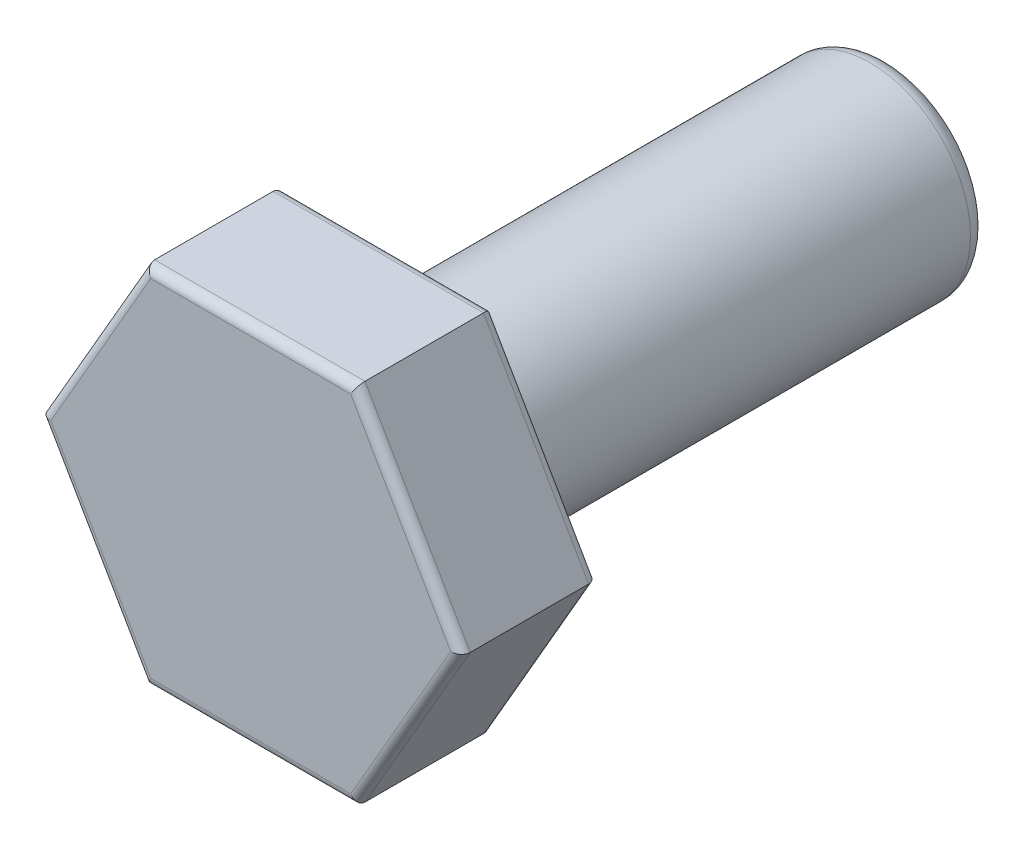
ISO-10303-21;
HEADER;
FILE_DESCRIPTION(('STEP AP214'),'2;1');
FILE_NAME('part.step','',(''),(''),'','','');
FILE_SCHEMA(('AUTOMOTIVE_DESIGN { 1 0 10303 214 1 1 1 1 }'));
ENDSEC;
DATA;
#1=APPLICATION_CONTEXT('core data for automotive mechanical design processes');
#2=APPLICATION_PROTOCOL_DEFINITION('international standard','automotive_design',2000,#1);
#3=PRODUCT_CONTEXT('',#1,'mechanical');
#4=PRODUCT('Part','Part','',(#3));
#5=PRODUCT_RELATED_PRODUCT_CATEGORY('part','',(#4));
#6=PRODUCT_DEFINITION_FORMATION('','',#4);
#7=PRODUCT_DEFINITION_CONTEXT('part definition',#1,'design');
#8=PRODUCT_DEFINITION('design','',#6,#7);
#9=PRODUCT_DEFINITION_SHAPE('','',#8);
#10=(LENGTH_UNIT() NAMED_UNIT(*) SI_UNIT(.MILLI.,.METRE.));
#11=(NAMED_UNIT(*) PLANE_ANGLE_UNIT() SI_UNIT($,.RADIAN.));
#12=(NAMED_UNIT(*) SI_UNIT($,.STERADIAN.) SOLID_ANGLE_UNIT());
#13=UNCERTAINTY_MEASURE_WITH_UNIT(LENGTH_MEASURE(1.E-05),#10,'distance_accuracy_value','');
#14=(GEOMETRIC_REPRESENTATION_CONTEXT(3) GLOBAL_UNCERTAINTY_ASSIGNED_CONTEXT((#13)) GLOBAL_UNIT_ASSIGNED_CONTEXT((#10,
#11,#12)) REPRESENTATION_CONTEXT('',''));
#15=CARTESIAN_POINT('',(0.,0.,0.));
#16=DIRECTION('',(0.,0.,1.));
#17=DIRECTION('',(1.,0.,0.));
#18=AXIS2_PLACEMENT_3D('',#15,#16,#17);
#19=CARTESIAN_POINT('',(0.,0.,55.));
#20=DIRECTION('',(0.,0.,-1.));
#21=DIRECTION('',(-1.,0.,0.));
#22=AXIS2_PLACEMENT_3D('',#19,#20,#21);
#23=CYLINDRICAL_SURFACE('',#22,11.);
#24=CARTESIAN_POINT('',(0.,0.,2.));
#25=DIRECTION('',(0.,0.,1.));
#26=DIRECTION('',(1.,0.,0.));
#27=AXIS2_PLACEMENT_3D('',#24,#25,#26);
#28=CIRCLE('',#27,11.);
#29=CARTESIAN_POINT('',(11.,0.,2.));
#30=VERTEX_POINT('',#29);
#31=EDGE_CURVE('E42',#30,#30,#28,.T.);
#32=ORIENTED_EDGE('',*,*,#31,.T.);
#33=EDGE_LOOP('',(#32));
#34=FACE_BOUND('',#33,.T.);
#35=CARTESIAN_POINT('',(0.,0.,55.));
#36=DIRECTION('',(0.,0.,1.));
#37=DIRECTION('',(1.,0.,0.));
#38=AXIS2_PLACEMENT_3D('',#35,#36,#37);
#39=CIRCLE('',#38,11.);
#40=CARTESIAN_POINT('',(11.,0.,55.));
#41=VERTEX_POINT('',#40);
#42=EDGE_CURVE('E148',#41,#41,#39,.T.);
#43=ORIENTED_EDGE('',*,*,#42,.F.);
#44=EDGE_LOOP('',(#43));
#45=FACE_BOUND('',#44,.T.);
#46=ADVANCED_FACE('F34',(#34,#45),#23,.T.);
#47=CARTESIAN_POINT('',(0.,0.,0.));
#48=DIRECTION('',(0.,0.,1.));
#49=DIRECTION('',(1.,0.,0.));
#50=AXIS2_PLACEMENT_3D('',#47,#48,#49);
#51=PLANE('',#50);
#52=CARTESIAN_POINT('',(0.,0.,0.));
#53=DIRECTION('',(0.,0.,1.));
#54=DIRECTION('',(1.,0.,0.));
#55=AXIS2_PLACEMENT_3D('',#52,#53,#54);
#56=CIRCLE('',#55,9.);
#57=CARTESIAN_POINT('',(9.,0.,0.));
#58=VERTEX_POINT('',#57);
#59=EDGE_CURVE('E11',#58,#58,#56,.F.);
#60=ORIENTED_EDGE('',*,*,#59,.T.);
#61=EDGE_LOOP('',(#60));
#62=FACE_BOUND('',#61,.T.);
#63=ADVANCED_FACE('F293',(#62),#51,.F.);
#64=CARTESIAN_POINT('',(0.,0.,55.));
#65=DIRECTION('',(0.,0.,1.));
#66=DIRECTION('',(1.,0.,0.));
#67=AXIS2_PLACEMENT_3D('',#64,#65,#66);
#68=PLANE('',#67);
#69=DIRECTION('',(-0.5,0.866025403784438,0.));
#70=VECTOR('',#69,1.);
#71=CARTESIAN_POINT('',(16.4544826719043,9.50000000000001,55.));
#72=LINE('',#71,#70);
#73=CARTESIAN_POINT('',(10.9696551146029,19.,55.));
#74=VERTEX_POINT('',#73);
#75=CARTESIAN_POINT('',(21.9393102292058,0.,55.));
#76=VERTEX_POINT('',#75);
#77=EDGE_CURVE('E208',#74,#76,#72,.F.);
#78=ORIENTED_EDGE('',*,*,#77,.T.);
#79=DIRECTION('',(0.5,0.866025403784439,0.));
#80=VECTOR('',#79,1.);
#81=CARTESIAN_POINT('',(16.4544826719043,-9.49999999999999,55.));
#82=LINE('',#81,#80);
#83=CARTESIAN_POINT('',(10.9696551146029,-19.,55.));
#84=VERTEX_POINT('',#83);
#85=EDGE_CURVE('E218',#76,#84,#82,.F.);
#86=ORIENTED_EDGE('',*,*,#85,.T.);
#87=DIRECTION('',(1.,0.,0.));
#88=VECTOR('',#87,1.);
#89=CARTESIAN_POINT('',(0.,-19.,55.));
#90=LINE('',#89,#88);
#91=CARTESIAN_POINT('',(-10.9696551146029,-19.,55.));
#92=VERTEX_POINT('',#91);
#93=EDGE_CURVE('E216',#84,#92,#90,.F.);
#94=ORIENTED_EDGE('',*,*,#93,.T.);
#95=DIRECTION('',(0.5,-0.866025403784439,0.));
#96=VECTOR('',#95,1.);
#97=CARTESIAN_POINT('',(-16.4544826719043,-9.5,55.));
#98=LINE('',#97,#96);
#99=CARTESIAN_POINT('',(-21.9393102292058,0.,55.));
#100=VERTEX_POINT('',#99);
#101=EDGE_CURVE('E214',#92,#100,#98,.F.);
#102=ORIENTED_EDGE('',*,*,#101,.T.);
#103=DIRECTION('',(-0.5,-0.866025403784439,0.));
#104=VECTOR('',#103,1.);
#105=CARTESIAN_POINT('',(-16.4544826719043,9.5,55.));
#106=LINE('',#105,#104);
#107=CARTESIAN_POINT('',(-10.9696551146029,19.,55.));
#108=VERTEX_POINT('',#107);
#109=EDGE_CURVE('E212',#100,#108,#106,.F.);
#110=ORIENTED_EDGE('',*,*,#109,.T.);
#111=DIRECTION('',(-1.,0.,0.));
#112=VECTOR('',#111,1.);
#113=CARTESIAN_POINT('',(0.,19.,55.));
#114=LINE('',#113,#112);
#115=EDGE_CURVE('E210',#108,#74,#114,.F.);
#116=ORIENTED_EDGE('',*,*,#115,.T.);
#117=EDGE_LOOP('',(#78,#86,#94,#102,#110,#116));
#118=FACE_BOUND('',#117,.T.);
#119=ORIENTED_EDGE('',*,*,#42,.T.);
#120=EDGE_LOOP('',(#119));
#121=FACE_BOUND('',#120,.T.);
#122=ADVANCED_FACE('F298',(#118,#121),#68,.F.);
#123=CARTESIAN_POINT('',(-11.5470053837925,-20.,70.));
#124=DIRECTION('',(0.,1.,0.));
#125=DIRECTION('',(0.,0.,1.));
#126=AXIS2_PLACEMENT_3D('',#123,#124,#125);
#127=PLANE('',#126);
#128=DIRECTION('',(0.,0.,-1.));
#129=VECTOR('',#128,1.);
#130=CARTESIAN_POINT('',(11.5470053837925,-20.,70.));
#131=LINE('',#130,#129);
#132=CARTESIAN_POINT('',(11.5470053837925,-20.,69.));
#133=VERTEX_POINT('',#132);
#134=CARTESIAN_POINT('',(11.5470053837925,-20.,56.));
#135=VERTEX_POINT('',#134);
#136=EDGE_CURVE('E264',#133,#135,#131,.T.);
#137=ORIENTED_EDGE('',*,*,#136,.F.);
#138=DIRECTION('',(1.,0.,0.));
#139=VECTOR('',#138,1.);
#140=CARTESIAN_POINT('',(-11.5470053837925,-20.,69.));
#141=LINE('',#140,#139);
#142=CARTESIAN_POINT('',(-11.5470053837925,-20.,69.));
#143=VERTEX_POINT('',#142);
#144=EDGE_CURVE('E203',#133,#143,#141,.F.);
#145=ORIENTED_EDGE('',*,*,#144,.T.);
#146=DIRECTION('',(0.,0.,-1.));
#147=VECTOR('',#146,1.);
#148=CARTESIAN_POINT('',(-11.5470053837925,-20.,70.));
#149=LINE('',#148,#147);
#150=CARTESIAN_POINT('',(-11.5470053837925,-20.,56.));
#151=VERTEX_POINT('',#150);
#152=EDGE_CURVE('E154',#143,#151,#149,.T.);
#153=ORIENTED_EDGE('',*,*,#152,.T.);
#154=DIRECTION('',(1.,0.,0.));
#155=VECTOR('',#154,1.);
#156=CARTESIAN_POINT('',(-11.5470053837925,-20.,56.));
#157=LINE('',#156,#155);
#158=EDGE_CURVE('E250',#151,#135,#157,.T.);
#159=ORIENTED_EDGE('',*,*,#158,.T.);
#160=EDGE_LOOP('',(#137,#145,#153,#159));
#161=FACE_BOUND('',#160,.T.);
#162=ADVANCED_FACE('F272',(#161),#127,.F.);
#163=CARTESIAN_POINT('',(11.5470053837925,-20.,70.));
#164=DIRECTION('',(-0.866025403784439,0.5,0.));
#165=DIRECTION('',(-0.5,-0.866025403784439,0.));
#166=AXIS2_PLACEMENT_3D('',#163,#164,#165);
#167=PLANE('',#166);
#168=DIRECTION('',(0.,0.,-1.));
#169=VECTOR('',#168,1.);
#170=CARTESIAN_POINT('',(23.094010767585,0.,70.));
#171=LINE('',#170,#169);
#172=CARTESIAN_POINT('',(23.094010767585,0.,69.));
#173=VERTEX_POINT('',#172);
#174=CARTESIAN_POINT('',(23.094010767585,0.,56.));
#175=VERTEX_POINT('',#174);
#176=EDGE_CURVE('E266',#173,#175,#171,.T.);
#177=ORIENTED_EDGE('',*,*,#176,.F.);
#178=DIRECTION('',(0.5,0.866025403784439,0.));
#179=VECTOR('',#178,1.);
#180=CARTESIAN_POINT('',(11.5470053837925,-20.,69.));
#181=LINE('',#180,#179);
#182=EDGE_CURVE('E193',#173,#133,#181,.F.);
#183=ORIENTED_EDGE('',*,*,#182,.T.);
#184=ORIENTED_EDGE('',*,*,#136,.T.);
#185=DIRECTION('',(0.5,0.866025403784439,0.));
#186=VECTOR('',#185,1.);
#187=CARTESIAN_POINT('',(11.5470053837925,-20.,56.));
#188=LINE('',#187,#186);
#189=EDGE_CURVE('E199',#135,#175,#188,.T.);
#190=ORIENTED_EDGE('',*,*,#189,.T.);
#191=EDGE_LOOP('',(#177,#183,#184,#190));
#192=FACE_BOUND('',#191,.T.);
#193=ADVANCED_FACE('F393',(#192),#167,.F.);
#194=CARTESIAN_POINT('',(23.094010767585,0.,70.));
#195=DIRECTION('',(-0.866025403784438,-0.5,0.));
#196=DIRECTION('',(0.5,-0.866025403784438,0.));
#197=AXIS2_PLACEMENT_3D('',#194,#195,#196);
#198=PLANE('',#197);
#199=DIRECTION('',(0.,0.,-1.));
#200=VECTOR('',#199,1.);
#201=CARTESIAN_POINT('',(11.5470053837925,20.,70.));
#202=LINE('',#201,#200);
#203=CARTESIAN_POINT('',(11.5470053837925,20.,69.));
#204=VERTEX_POINT('',#203);
#205=CARTESIAN_POINT('',(11.5470053837925,20.,56.));
#206=VERTEX_POINT('',#205);
#207=EDGE_CURVE('E269',#204,#206,#202,.T.);
#208=ORIENTED_EDGE('',*,*,#207,.F.);
#209=DIRECTION('',(-0.5,0.866025403784438,0.));
#210=VECTOR('',#209,1.);
#211=CARTESIAN_POINT('',(23.094010767585,0.,69.));
#212=LINE('',#211,#210);
#213=EDGE_CURVE('E151',#204,#173,#212,.F.);
#214=ORIENTED_EDGE('',*,*,#213,.T.);
#215=ORIENTED_EDGE('',*,*,#176,.T.);
#216=DIRECTION('',(-0.5,0.866025403784438,0.));
#217=VECTOR('',#216,1.);
#218=CARTESIAN_POINT('',(23.094010767585,0.,56.));
#219=LINE('',#218,#217);
#220=EDGE_CURVE('E198',#175,#206,#219,.T.);
#221=ORIENTED_EDGE('',*,*,#220,.T.);
#222=EDGE_LOOP('',(#208,#214,#215,#221));
#223=FACE_BOUND('',#222,.T.);
#224=ADVANCED_FACE('F399',(#223),#198,.F.);
#225=CARTESIAN_POINT('',(11.5470053837925,20.,70.));
#226=DIRECTION('',(0.,-1.,0.));
#227=DIRECTION('',(0.,0.,-1.));
#228=AXIS2_PLACEMENT_3D('',#225,#226,#227);
#229=PLANE('',#228);
#230=DIRECTION('',(0.,0.,-1.));
#231=VECTOR('',#230,1.);
#232=CARTESIAN_POINT('',(-11.5470053837925,20.,70.));
#233=LINE('',#232,#231);
#234=CARTESIAN_POINT('',(-11.5470053837925,20.,69.));
#235=VERTEX_POINT('',#234);
#236=CARTESIAN_POINT('',(-11.5470053837925,20.,56.));
#237=VERTEX_POINT('',#236);
#238=EDGE_CURVE('E229',#235,#237,#233,.T.);
#239=ORIENTED_EDGE('',*,*,#238,.F.);
#240=DIRECTION('',(-1.,0.,0.));
#241=VECTOR('',#240,1.);
#242=CARTESIAN_POINT('',(11.5470053837925,20.,69.));
#243=LINE('',#242,#241);
#244=EDGE_CURVE('E178',#235,#204,#243,.F.);
#245=ORIENTED_EDGE('',*,*,#244,.T.);
#246=ORIENTED_EDGE('',*,*,#207,.T.);
#247=DIRECTION('',(-1.,0.,0.));
#248=VECTOR('',#247,1.);
#249=CARTESIAN_POINT('',(11.5470053837925,20.,56.));
#250=LINE('',#249,#248);
#251=EDGE_CURVE('E49',#206,#237,#250,.T.);
#252=ORIENTED_EDGE('',*,*,#251,.T.);
#253=EDGE_LOOP('',(#239,#245,#246,#252));
#254=FACE_BOUND('',#253,.T.);
#255=ADVANCED_FACE('F406',(#254),#229,.F.);
#256=CARTESIAN_POINT('',(-11.5470053837925,20.,70.));
#257=DIRECTION('',(0.866025403784439,-0.5,0.));
#258=DIRECTION('',(0.5,0.866025403784439,0.));
#259=AXIS2_PLACEMENT_3D('',#256,#257,#258);
#260=PLANE('',#259);
#261=ORIENTED_EDGE('',*,*,#238,.T.);
#262=DIRECTION('',(-0.5,-0.866025403784439,0.));
#263=VECTOR('',#262,1.);
#264=CARTESIAN_POINT('',(-11.5470053837925,20.,56.));
#265=LINE('',#264,#263);
#266=CARTESIAN_POINT('',(-23.094010767585,0.,56.));
#267=VERTEX_POINT('',#266);
#268=EDGE_CURVE('E183',#237,#267,#265,.T.);
#269=ORIENTED_EDGE('',*,*,#268,.T.);
#270=DIRECTION('',(0.,0.,-1.));
#271=VECTOR('',#270,1.);
#272=CARTESIAN_POINT('',(-23.094010767585,0.,70.));
#273=LINE('',#272,#271);
#274=CARTESIAN_POINT('',(-23.094010767585,0.,69.));
#275=VERTEX_POINT('',#274);
#276=EDGE_CURVE('E228',#275,#267,#273,.T.);
#277=ORIENTED_EDGE('',*,*,#276,.F.);
#278=DIRECTION('',(-0.5,-0.866025403784439,0.));
#279=VECTOR('',#278,1.);
#280=CARTESIAN_POINT('',(-11.5470053837925,20.,69.));
#281=LINE('',#280,#279);
#282=EDGE_CURVE('E56',#275,#235,#281,.F.);
#283=ORIENTED_EDGE('',*,*,#282,.T.);
#284=EDGE_LOOP('',(#261,#269,#277,#283));
#285=FACE_BOUND('',#284,.T.);
#286=ADVANCED_FACE('F227',(#285),#260,.F.);
#287=CARTESIAN_POINT('',(-23.094010767585,0.,70.));
#288=DIRECTION('',(0.866025403784439,0.5,0.));
#289=DIRECTION('',(-0.5,0.866025403784439,0.));
#290=AXIS2_PLACEMENT_3D('',#287,#288,#289);
#291=PLANE('',#290);
#292=ORIENTED_EDGE('',*,*,#152,.F.);
#293=DIRECTION('',(0.5,-0.866025403784439,0.));
#294=VECTOR('',#293,1.);
#295=CARTESIAN_POINT('',(-23.094010767585,0.,69.));
#296=LINE('',#295,#294);
#297=EDGE_CURVE('E223',#143,#275,#296,.F.);
#298=ORIENTED_EDGE('',*,*,#297,.T.);
#299=ORIENTED_EDGE('',*,*,#276,.T.);
#300=DIRECTION('',(0.5,-0.866025403784439,0.));
#301=VECTOR('',#300,1.);
#302=CARTESIAN_POINT('',(-23.094010767585,0.,56.));
#303=LINE('',#302,#301);
#304=EDGE_CURVE('E221',#267,#151,#303,.T.);
#305=ORIENTED_EDGE('',*,*,#304,.T.);
#306=EDGE_LOOP('',(#292,#298,#299,#305));
#307=FACE_BOUND('',#306,.T.);
#308=ADVANCED_FACE('F235',(#307),#291,.F.);
#309=CARTESIAN_POINT('',(0.,0.,70.));
#310=DIRECTION('',(0.,0.,1.));
#311=DIRECTION('',(1.,0.,0.));
#312=AXIS2_PLACEMENT_3D('',#309,#310,#311);
#313=PLANE('',#312);
#314=DIRECTION('',(0.5,-0.866025403784439,0.));
#315=VECTOR('',#314,1.);
#316=CARTESIAN_POINT('',(-10.6809799800081,-19.5,70.));
#317=LINE('',#316,#315);
#318=CARTESIAN_POINT('',(-21.9393102292058,0.,70.));
#319=VERTEX_POINT('',#318);
#320=CARTESIAN_POINT('',(-10.9696551146029,-19.,70.));
#321=VERTEX_POINT('',#320);
#322=EDGE_CURVE('E136',#319,#321,#317,.T.);
#323=ORIENTED_EDGE('',*,*,#322,.T.);
#324=DIRECTION('',(1.,0.,0.));
#325=VECTOR('',#324,1.);
#326=CARTESIAN_POINT('',(11.5470053837925,-19.,70.));
#327=LINE('',#326,#325);
#328=CARTESIAN_POINT('',(10.9696551146029,-19.,70.));
#329=VERTEX_POINT('',#328);
#330=EDGE_CURVE('E254',#321,#329,#327,.T.);
#331=ORIENTED_EDGE('',*,*,#330,.T.);
#332=DIRECTION('',(0.5,0.866025403784439,0.));
#333=VECTOR('',#332,1.);
#334=CARTESIAN_POINT('',(22.2279853638006,0.500000000000018,70.));
#335=LINE('',#334,#333);
#336=CARTESIAN_POINT('',(21.9393102292058,0.,70.));
#337=VERTEX_POINT('',#336);
#338=EDGE_CURVE('E131',#329,#337,#335,.T.);
#339=ORIENTED_EDGE('',*,*,#338,.T.);
#340=DIRECTION('',(-0.5,0.866025403784438,0.));
#341=VECTOR('',#340,1.);
#342=CARTESIAN_POINT('',(10.6809799800081,19.5,70.));
#343=LINE('',#342,#341);
#344=CARTESIAN_POINT('',(10.9696551146029,19.,70.));
#345=VERTEX_POINT('',#344);
#346=EDGE_CURVE('E124',#337,#345,#343,.T.);
#347=ORIENTED_EDGE('',*,*,#346,.T.);
#348=DIRECTION('',(-1.,0.,0.));
#349=VECTOR('',#348,1.);
#350=CARTESIAN_POINT('',(-11.5470053837925,19.,70.));
#351=LINE('',#350,#349);
#352=CARTESIAN_POINT('',(-10.9696551146029,19.,70.));
#353=VERTEX_POINT('',#352);
#354=EDGE_CURVE('E127',#345,#353,#351,.T.);
#355=ORIENTED_EDGE('',*,*,#354,.T.);
#356=DIRECTION('',(-0.5,-0.866025403784439,0.));
#357=VECTOR('',#356,1.);
#358=CARTESIAN_POINT('',(-22.2279853638006,-0.500000000000004,70.));
#359=LINE('',#358,#357);
#360=EDGE_CURVE('E147',#353,#319,#359,.T.);
#361=ORIENTED_EDGE('',*,*,#360,.T.);
#362=EDGE_LOOP('',(#323,#331,#339,#347,#355,#361));
#363=FACE_BOUND('',#362,.T.);
#364=ADVANCED_FACE('F126',(#363),#313,.T.);
#365=CARTESIAN_POINT('',(0.,19.,69.));
#366=DIRECTION('',(1.,0.,0.));
#367=DIRECTION('',(0.,0.,-1.));
#368=AXIS2_PLACEMENT_3D('',#365,#366,#367);
#369=CYLINDRICAL_SURFACE('',#368,1.);
#370=CARTESIAN_POINT('',(10.9696551146029,19.,69.));
#371=DIRECTION('',(0.866025403784439,-0.5,0.));
#372=DIRECTION('',(0.5,0.866025403784439,0.));
#373=AXIS2_PLACEMENT_3D('',#370,#371,#372);
#374=ELLIPSE('',#373,1.15470053837925,1.);
#375=EDGE_CURVE('E142',#204,#345,#374,.T.);
#376=ORIENTED_EDGE('',*,*,#375,.F.);
#377=ORIENTED_EDGE('',*,*,#244,.F.);
#378=CARTESIAN_POINT('',(-10.9696551146029,19.,69.));
#379=DIRECTION('',(0.866025403784439,0.5,0.));
#380=DIRECTION('',(0.5,-0.866025403784439,0.));
#381=AXIS2_PLACEMENT_3D('',#378,#379,#380);
#382=ELLIPSE('',#381,1.15470053837925,1.);
#383=EDGE_CURVE('E145',#353,#235,#382,.F.);
#384=ORIENTED_EDGE('',*,*,#383,.F.);
#385=ORIENTED_EDGE('',*,*,#354,.F.);
#386=EDGE_LOOP('',(#376,#377,#384,#385));
#387=FACE_BOUND('',#386,.T.);
#388=ADVANCED_FACE('F140',(#387),#369,.T.);
#389=CARTESIAN_POINT('',(-16.4544826719043,9.5,69.));
#390=DIRECTION('',(0.5,0.866025403784439,0.));
#391=DIRECTION('',(-0.866025403784439,0.5,0.));
#392=AXIS2_PLACEMENT_3D('',#389,#390,#391);
#393=CYLINDRICAL_SURFACE('',#392,1.);
#394=ORIENTED_EDGE('',*,*,#383,.T.);
#395=ORIENTED_EDGE('',*,*,#282,.F.);
#396=CARTESIAN_POINT('',(-21.9393102292058,0.,69.));
#397=DIRECTION('',(0.,1.,0.));
#398=DIRECTION('',(1.,0.,0.));
#399=AXIS2_PLACEMENT_3D('',#396,#397,#398);
#400=ELLIPSE('',#399,1.15470053837925,1.);
#401=EDGE_CURVE('E152',#319,#275,#400,.F.);
#402=ORIENTED_EDGE('',*,*,#401,.F.);
#403=ORIENTED_EDGE('',*,*,#360,.F.);
#404=EDGE_LOOP('',(#394,#395,#402,#403));
#405=FACE_BOUND('',#404,.T.);
#406=ADVANCED_FACE('F283',(#405),#393,.T.);
#407=CARTESIAN_POINT('',(16.4544826719043,9.50000000000001,69.));
#408=DIRECTION('',(0.5,-0.866025403784438,0.));
#409=DIRECTION('',(0.866025403784438,0.5,0.));
#410=AXIS2_PLACEMENT_3D('',#407,#408,#409);
#411=CYLINDRICAL_SURFACE('',#410,1.);
#412=ORIENTED_EDGE('',*,*,#375,.T.);
#413=ORIENTED_EDGE('',*,*,#346,.F.);
#414=CARTESIAN_POINT('',(21.9393102292058,0.,69.));
#415=DIRECTION('',(0.,-1.,0.));
#416=DIRECTION('',(1.,0.,0.));
#417=AXIS2_PLACEMENT_3D('',#414,#415,#416);
#418=ELLIPSE('',#417,1.15470053837925,1.);
#419=EDGE_CURVE('E157',#173,#337,#418,.T.);
#420=ORIENTED_EDGE('',*,*,#419,.F.);
#421=ORIENTED_EDGE('',*,*,#213,.F.);
#422=EDGE_LOOP('',(#412,#413,#420,#421));
#423=FACE_BOUND('',#422,.T.);
#424=ADVANCED_FACE('F150',(#423),#411,.T.);
#425=CARTESIAN_POINT('',(-16.4544826719043,-9.5,69.));
#426=DIRECTION('',(-0.5,0.866025403784439,0.));
#427=DIRECTION('',(-0.866025403784439,-0.5,0.));
#428=AXIS2_PLACEMENT_3D('',#425,#426,#427);
#429=CYLINDRICAL_SURFACE('',#428,1.);
#430=ORIENTED_EDGE('',*,*,#401,.T.);
#431=ORIENTED_EDGE('',*,*,#297,.F.);
#432=CARTESIAN_POINT('',(-10.9696551146029,-19.,69.));
#433=DIRECTION('',(-0.866025403784439,0.5,0.));
#434=DIRECTION('',(0.5,0.866025403784439,0.));
#435=AXIS2_PLACEMENT_3D('',#432,#433,#434);
#436=ELLIPSE('',#435,1.15470053837925,1.);
#437=EDGE_CURVE('E188',#321,#143,#436,.F.);
#438=ORIENTED_EDGE('',*,*,#437,.F.);
#439=ORIENTED_EDGE('',*,*,#322,.F.);
#440=EDGE_LOOP('',(#430,#431,#438,#439));
#441=FACE_BOUND('',#440,.T.);
#442=ADVANCED_FACE('F280',(#441),#429,.T.);
#443=CARTESIAN_POINT('',(16.4544826719043,-9.49999999999999,69.));
#444=DIRECTION('',(-0.5,-0.866025403784439,0.));
#445=DIRECTION('',(0.866025403784439,-0.5,0.));
#446=AXIS2_PLACEMENT_3D('',#443,#444,#445);
#447=CYLINDRICAL_SURFACE('',#446,1.);
#448=ORIENTED_EDGE('',*,*,#419,.T.);
#449=ORIENTED_EDGE('',*,*,#338,.F.);
#450=CARTESIAN_POINT('',(10.9696551146029,-19.,69.));
#451=DIRECTION('',(-0.866025403784439,-0.5,0.));
#452=DIRECTION('',(0.5,-0.866025403784439,0.));
#453=AXIS2_PLACEMENT_3D('',#450,#451,#452);
#454=ELLIPSE('',#453,1.15470053837925,1.);
#455=EDGE_CURVE('E176',#133,#329,#454,.T.);
#456=ORIENTED_EDGE('',*,*,#455,.F.);
#457=ORIENTED_EDGE('',*,*,#182,.F.);
#458=EDGE_LOOP('',(#448,#449,#456,#457));
#459=FACE_BOUND('',#458,.T.);
#460=ADVANCED_FACE('F191',(#459),#447,.T.);
#461=CARTESIAN_POINT('',(0.,-19.,69.));
#462=DIRECTION('',(-1.,0.,0.));
#463=DIRECTION('',(0.,0.,1.));
#464=AXIS2_PLACEMENT_3D('',#461,#462,#463);
#465=CYLINDRICAL_SURFACE('',#464,1.);
#466=ORIENTED_EDGE('',*,*,#437,.T.);
#467=ORIENTED_EDGE('',*,*,#144,.F.);
#468=ORIENTED_EDGE('',*,*,#455,.T.);
#469=ORIENTED_EDGE('',*,*,#330,.F.);
#470=EDGE_LOOP('',(#466,#467,#468,#469));
#471=FACE_BOUND('',#470,.T.);
#472=ADVANCED_FACE('F275',(#471),#465,.T.);
#473=CARTESIAN_POINT('',(-10.6809799800081,19.5,56.));
#474=DIRECTION('',(-0.5,-0.866025403784439,0.));
#475=DIRECTION('',(0.866025403784439,-0.5,0.));
#476=AXIS2_PLACEMENT_3D('',#473,#474,#475);
#477=CYLINDRICAL_SURFACE('',#476,1.);
#478=CARTESIAN_POINT('',(-10.9696551146029,19.,56.));
#479=DIRECTION('',(-0.866025403784439,-0.5,0.));
#480=DIRECTION('',(-0.5,0.866025403784439,0.));
#481=AXIS2_PLACEMENT_3D('',#478,#479,#480);
#482=ELLIPSE('',#481,1.15470053837925,1.);
#483=EDGE_CURVE('E171',#108,#237,#482,.F.);
#484=ORIENTED_EDGE('',*,*,#483,.F.);
#485=ORIENTED_EDGE('',*,*,#109,.F.);
#486=CARTESIAN_POINT('',(-21.9393102292058,0.,56.));
#487=DIRECTION('',(0.,-1.,0.));
#488=DIRECTION('',(-1.,0.,0.));
#489=AXIS2_PLACEMENT_3D('',#486,#487,#488);
#490=ELLIPSE('',#489,1.15470053837925,1.);
#491=EDGE_CURVE('E174',#267,#100,#490,.T.);
#492=ORIENTED_EDGE('',*,*,#491,.F.);
#493=ORIENTED_EDGE('',*,*,#268,.F.);
#494=EDGE_LOOP('',(#484,#485,#492,#493));
#495=FACE_BOUND('',#494,.T.);
#496=ADVANCED_FACE('F241',(#495),#477,.T.);
#497=CARTESIAN_POINT('',(-22.2279853638006,0.499999999999997,56.));
#498=DIRECTION('',(0.5,-0.866025403784439,0.));
#499=DIRECTION('',(0.866025403784439,0.5,0.));
#500=AXIS2_PLACEMENT_3D('',#497,#498,#499);
#501=CYLINDRICAL_SURFACE('',#500,1.);
#502=ORIENTED_EDGE('',*,*,#491,.T.);
#503=ORIENTED_EDGE('',*,*,#101,.F.);
#504=CARTESIAN_POINT('',(-10.9696551146029,-19.,56.));
#505=DIRECTION('',(0.866025403784439,-0.5,0.));
#506=DIRECTION('',(-0.5,-0.866025403784439,0.));
#507=AXIS2_PLACEMENT_3D('',#504,#505,#506);
#508=ELLIPSE('',#507,1.15470053837925,1.);
#509=EDGE_CURVE('E168',#151,#92,#508,.T.);
#510=ORIENTED_EDGE('',*,*,#509,.F.);
#511=ORIENTED_EDGE('',*,*,#304,.F.);
#512=EDGE_LOOP('',(#502,#503,#510,#511));
#513=FACE_BOUND('',#512,.T.);
#514=ADVANCED_FACE('F245',(#513),#501,.T.);
#515=CARTESIAN_POINT('',(11.5470053837925,19.,56.));
#516=DIRECTION('',(-1.,0.,0.));
#517=DIRECTION('',(0.,0.,1.));
#518=AXIS2_PLACEMENT_3D('',#515,#516,#517);
#519=CYLINDRICAL_SURFACE('',#518,1.);
#520=ORIENTED_EDGE('',*,*,#483,.T.);
#521=ORIENTED_EDGE('',*,*,#251,.F.);
#522=CARTESIAN_POINT('',(10.9696551146029,19.,56.));
#523=DIRECTION('',(-0.866025403784439,0.5,0.));
#524=DIRECTION('',(0.5,0.866025403784439,0.));
#525=AXIS2_PLACEMENT_3D('',#522,#523,#524);
#526=ELLIPSE('',#525,1.15470053837925,1.);
#527=EDGE_CURVE('E165',#74,#206,#526,.F.);
#528=ORIENTED_EDGE('',*,*,#527,.F.);
#529=ORIENTED_EDGE('',*,*,#115,.F.);
#530=EDGE_LOOP('',(#520,#521,#528,#529));
#531=FACE_BOUND('',#530,.T.);
#532=ADVANCED_FACE('F332',(#531),#519,.T.);
#533=CARTESIAN_POINT('',(-11.5470053837925,-19.,56.));
#534=DIRECTION('',(1.,0.,0.));
#535=DIRECTION('',(0.,0.,-1.));
#536=AXIS2_PLACEMENT_3D('',#533,#534,#535);
#537=CYLINDRICAL_SURFACE('',#536,1.);
#538=ORIENTED_EDGE('',*,*,#509,.T.);
#539=ORIENTED_EDGE('',*,*,#93,.F.);
#540=CARTESIAN_POINT('',(10.9696551146029,-19.,56.));
#541=DIRECTION('',(0.866025403784439,0.5,0.));
#542=DIRECTION('',(0.5,-0.866025403784439,0.));
#543=AXIS2_PLACEMENT_3D('',#540,#541,#542);
#544=ELLIPSE('',#543,1.15470053837925,1.);
#545=EDGE_CURVE('E163',#135,#84,#544,.T.);
#546=ORIENTED_EDGE('',*,*,#545,.F.);
#547=ORIENTED_EDGE('',*,*,#158,.F.);
#548=EDGE_LOOP('',(#538,#539,#546,#547));
#549=FACE_BOUND('',#548,.T.);
#550=ADVANCED_FACE('F251',(#549),#537,.T.);
#551=CARTESIAN_POINT('',(22.2279853638006,-0.499999999999986,56.));
#552=DIRECTION('',(-0.5,0.866025403784438,0.));
#553=DIRECTION('',(-0.866025403784438,-0.5,0.));
#554=AXIS2_PLACEMENT_3D('',#551,#552,#553);
#555=CYLINDRICAL_SURFACE('',#554,1.);
#556=ORIENTED_EDGE('',*,*,#527,.T.);
#557=ORIENTED_EDGE('',*,*,#220,.F.);
#558=CARTESIAN_POINT('',(21.9393102292058,0.,56.));
#559=DIRECTION('',(0.,1.,0.));
#560=DIRECTION('',(-1.,0.,0.));
#561=AXIS2_PLACEMENT_3D('',#558,#559,#560);
#562=ELLIPSE('',#561,1.15470053837925,1.);
#563=EDGE_CURVE('E161',#76,#175,#562,.F.);
#564=ORIENTED_EDGE('',*,*,#563,.F.);
#565=ORIENTED_EDGE('',*,*,#77,.F.);
#566=EDGE_LOOP('',(#556,#557,#564,#565));
#567=FACE_BOUND('',#566,.T.);
#568=ADVANCED_FACE('F346',(#567),#555,.T.);
#569=CARTESIAN_POINT('',(10.6809799800081,-19.5,56.));
#570=DIRECTION('',(0.5,0.866025403784439,0.));
#571=DIRECTION('',(-0.866025403784439,0.5,0.));
#572=AXIS2_PLACEMENT_3D('',#569,#570,#571);
#573=CYLINDRICAL_SURFACE('',#572,1.);
#574=ORIENTED_EDGE('',*,*,#545,.T.);
#575=ORIENTED_EDGE('',*,*,#85,.F.);
#576=ORIENTED_EDGE('',*,*,#563,.T.);
#577=ORIENTED_EDGE('',*,*,#189,.F.);
#578=EDGE_LOOP('',(#574,#575,#576,#577));
#579=FACE_BOUND('',#578,.T.);
#580=ADVANCED_FACE('F353',(#579),#573,.T.);
#581=CARTESIAN_POINT('',(0.,0.,2.));
#582=DIRECTION('',(0.,0.,1.));
#583=DIRECTION('',(1.,0.,0.));
#584=AXIS2_PLACEMENT_3D('',#581,#582,#583);
#585=TOROIDAL_SURFACE('',#584,9.,2.);
#586=ORIENTED_EDGE('',*,*,#59,.F.);
#587=EDGE_LOOP('',(#586));
#588=FACE_BOUND('',#587,.T.);
#589=ORIENTED_EDGE('',*,*,#31,.F.);
#590=EDGE_LOOP('',(#589));
#591=FACE_BOUND('',#590,.T.);
#592=ADVANCED_FACE('F36',(#588,#591),#585,.T.);
#593=CLOSED_SHELL('',(#46,#63,#122,#162,#193,#224,#255,#286,#308,#364,#388,#406,#424,#442,#460,
#472,#496,#514,#532,#550,#568,#580,#592));
#594=MANIFOLD_SOLID_BREP('B2',#593);
#595=ADVANCED_BREP_SHAPE_REPRESENTATION('',(#18,#594),#14);
#596=SHAPE_DEFINITION_REPRESENTATION(#9,#595);
ENDSEC;
END-ISO-10303-21;
